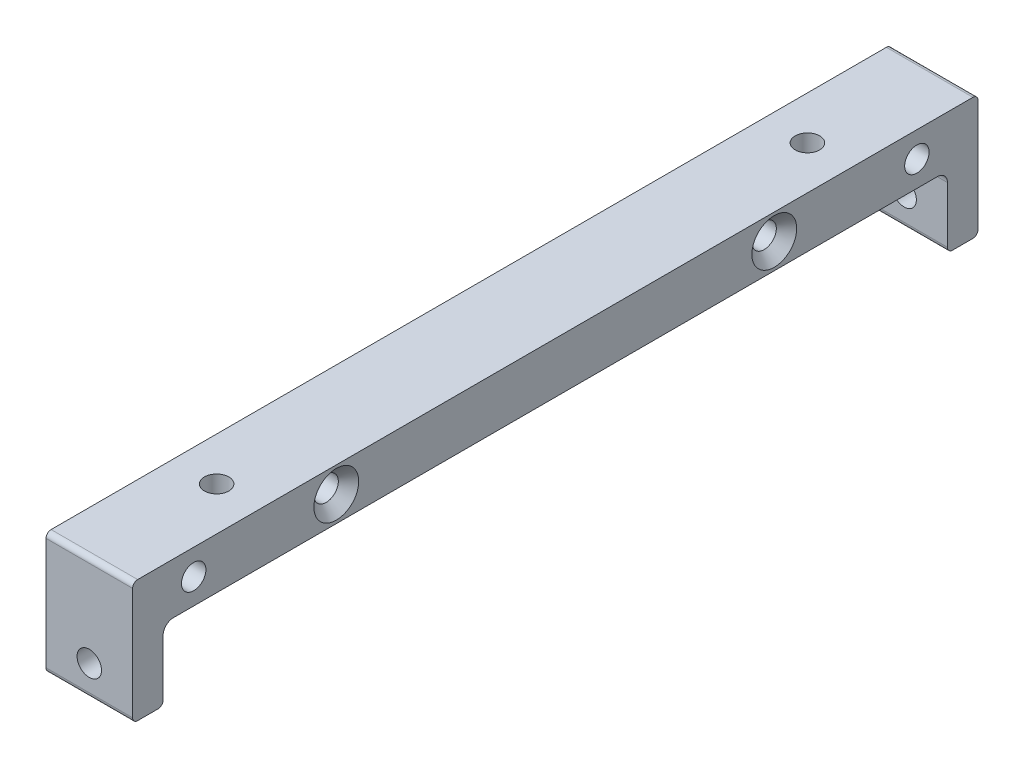
ISO-10303-21;
HEADER;
FILE_DESCRIPTION(('STEP AP214'),'2;1');
FILE_NAME('part.step','',(''),(''),'','','');
FILE_SCHEMA(('AUTOMOTIVE_DESIGN { 1 0 10303 214 1 1 1 1 }'));
ENDSEC;
DATA;
#1=APPLICATION_CONTEXT('core data for automotive mechanical design processes');
#2=APPLICATION_PROTOCOL_DEFINITION('international standard','automotive_design',2000,#1);
#3=PRODUCT_CONTEXT('',#1,'mechanical');
#4=PRODUCT('Part','Part','',(#3));
#5=PRODUCT_RELATED_PRODUCT_CATEGORY('part','',(#4));
#6=PRODUCT_DEFINITION_FORMATION('','',#4);
#7=PRODUCT_DEFINITION_CONTEXT('part definition',#1,'design');
#8=PRODUCT_DEFINITION('design','',#6,#7);
#9=PRODUCT_DEFINITION_SHAPE('','',#8);
#10=(LENGTH_UNIT() NAMED_UNIT(*) SI_UNIT(.MILLI.,.METRE.));
#11=(NAMED_UNIT(*) PLANE_ANGLE_UNIT() SI_UNIT($,.RADIAN.));
#12=(NAMED_UNIT(*) SI_UNIT($,.STERADIAN.) SOLID_ANGLE_UNIT());
#13=UNCERTAINTY_MEASURE_WITH_UNIT(LENGTH_MEASURE(1.E-05),#10,'distance_accuracy_value','');
#14=(GEOMETRIC_REPRESENTATION_CONTEXT(3) GLOBAL_UNCERTAINTY_ASSIGNED_CONTEXT((#13)) GLOBAL_UNIT_ASSIGNED_CONTEXT((#10,
#11,#12)) REPRESENTATION_CONTEXT('',''));
#15=CARTESIAN_POINT('',(0.,0.,0.));
#16=DIRECTION('',(0.,0.,1.));
#17=DIRECTION('',(1.,0.,0.));
#18=AXIS2_PLACEMENT_3D('',#15,#16,#17);
#19=CARTESIAN_POINT('',(-4.25,-6.,41.5));
#20=DIRECTION('',(0.,1.,0.));
#21=DIRECTION('',(0.,0.,1.));
#22=AXIS2_PLACEMENT_3D('',#19,#20,#21);
#23=PLANE('',#22);
#24=DIRECTION('',(0.,0.,-1.));
#25=VECTOR('',#24,1.);
#26=CARTESIAN_POINT('',(-4.25,-6.,41.5));
#27=LINE('',#26,#25);
#28=CARTESIAN_POINT('',(-4.25,-6.,41.));
#29=VERTEX_POINT('',#28);
#30=CARTESIAN_POINT('',(-4.25,-6.,39.));
#31=VERTEX_POINT('',#30);
#32=EDGE_CURVE('E274',#29,#31,#27,.T.);
#33=ORIENTED_EDGE('',*,*,#32,.T.);
#34=DIRECTION('',(1.,0.,0.));
#35=VECTOR('',#34,1.);
#36=CARTESIAN_POINT('',(-4.25,-6.,39.));
#37=LINE('',#36,#35);
#38=CARTESIAN_POINT('',(4.25,-6.,39.));
#39=VERTEX_POINT('',#38);
#40=EDGE_CURVE('E319',#31,#39,#37,.T.);
#41=ORIENTED_EDGE('',*,*,#40,.T.);
#42=DIRECTION('',(0.,0.,-1.));
#43=VECTOR('',#42,1.);
#44=CARTESIAN_POINT('',(4.25,-6.,41.5));
#45=LINE('',#44,#43);
#46=CARTESIAN_POINT('',(4.25,-6.,41.));
#47=VERTEX_POINT('',#46);
#48=EDGE_CURVE('E270',#47,#39,#45,.T.);
#49=ORIENTED_EDGE('',*,*,#48,.F.);
#50=DIRECTION('',(1.,0.,0.));
#51=VECTOR('',#50,1.);
#52=CARTESIAN_POINT('',(-4.25,-6.,41.));
#53=LINE('',#52,#51);
#54=EDGE_CURVE('E317',#47,#29,#53,.F.);
#55=ORIENTED_EDGE('',*,*,#54,.T.);
#56=EDGE_LOOP('',(#33,#41,#49,#55));
#57=FACE_BOUND('',#56,.T.);
#58=ADVANCED_FACE('F34',(#57),#23,.F.);
#59=CARTESIAN_POINT('',(4.25,-6.,41.5));
#60=DIRECTION('',(-1.,0.,0.));
#61=DIRECTION('',(0.,0.,1.));
#62=AXIS2_PLACEMENT_3D('',#59,#60,#61);
#63=PLANE('',#62);
#64=CARTESIAN_POINT('',(4.25,3.5,21.5));
#65=DIRECTION('',(1.,0.,0.));
#66=DIRECTION('',(0.,0.,-1.));
#67=AXIS2_PLACEMENT_3D('',#64,#65,#66);
#68=CIRCLE('',#67,2.2);
#69=CARTESIAN_POINT('',(4.25,3.5,19.3));
#70=VERTEX_POINT('',#69);
#71=EDGE_CURVE('E190',#70,#70,#68,.T.);
#72=ORIENTED_EDGE('',*,*,#71,.F.);
#73=EDGE_LOOP('',(#72));
#74=FACE_BOUND('',#73,.T.);
#75=CARTESIAN_POINT('',(4.25,3.5,-21.5));
#76=DIRECTION('',(1.,0.,0.));
#77=DIRECTION('',(0.,0.,-1.));
#78=AXIS2_PLACEMENT_3D('',#75,#76,#77);
#79=CIRCLE('',#78,2.2);
#80=CARTESIAN_POINT('',(4.25,3.5,-23.7));
#81=VERTEX_POINT('',#80);
#82=EDGE_CURVE('E199',#81,#81,#79,.T.);
#83=ORIENTED_EDGE('',*,*,#82,.F.);
#84=EDGE_LOOP('',(#83));
#85=FACE_BOUND('',#84,.T.);
#86=CARTESIAN_POINT('',(4.25,3.5,35.5));
#87=DIRECTION('',(1.,0.,0.));
#88=DIRECTION('',(0.,0.,-1.));
#89=AXIS2_PLACEMENT_3D('',#86,#87,#88);
#90=CIRCLE('',#89,1.2);
#91=CARTESIAN_POINT('',(4.25,3.5,34.3));
#92=VERTEX_POINT('',#91);
#93=EDGE_CURVE('E208',#92,#92,#90,.T.);
#94=ORIENTED_EDGE('',*,*,#93,.F.);
#95=EDGE_LOOP('',(#94));
#96=FACE_BOUND('',#95,.T.);
#97=CARTESIAN_POINT('',(4.25,3.5,-35.5));
#98=DIRECTION('',(1.,0.,0.));
#99=DIRECTION('',(0.,0.,-1.));
#100=AXIS2_PLACEMENT_3D('',#97,#98,#99);
#101=CIRCLE('',#100,1.2);
#102=CARTESIAN_POINT('',(4.25,3.5,-36.7));
#103=VERTEX_POINT('',#102);
#104=EDGE_CURVE('E214',#103,#103,#101,.T.);
#105=ORIENTED_EDGE('',*,*,#104,.F.);
#106=EDGE_LOOP('',(#105));
#107=FACE_BOUND('',#106,.T.);
#108=CARTESIAN_POINT('',(4.25,-6.,-39.));
#109=VERTEX_POINT('',#108);
#110=CARTESIAN_POINT('',(4.25,-6.,-41.));
#111=VERTEX_POINT('',#110);
#112=EDGE_CURVE('E265',#109,#111,#45,.T.);
#113=ORIENTED_EDGE('',*,*,#112,.T.);
#114=CARTESIAN_POINT('',(4.25,-5.5,-41.));
#115=DIRECTION('',(-1.,0.,0.));
#116=DIRECTION('',(0.,0.,1.));
#117=AXIS2_PLACEMENT_3D('',#114,#115,#116);
#118=CIRCLE('',#117,0.5);
#119=CARTESIAN_POINT('',(4.25,-5.5,-41.5));
#120=VERTEX_POINT('',#119);
#121=EDGE_CURVE('E298',#111,#120,#118,.F.);
#122=ORIENTED_EDGE('',*,*,#121,.T.);
#123=DIRECTION('',(0.,1.,0.));
#124=VECTOR('',#123,1.);
#125=CARTESIAN_POINT('',(4.25,-6.,-41.5));
#126=LINE('',#125,#124);
#127=CARTESIAN_POINT('',(4.25,5.5,-41.5));
#128=VERTEX_POINT('',#127);
#129=EDGE_CURVE('E251',#120,#128,#126,.T.);
#130=ORIENTED_EDGE('',*,*,#129,.T.);
#131=CARTESIAN_POINT('',(4.25,5.5,-41.));
#132=DIRECTION('',(-1.,0.,0.));
#133=DIRECTION('',(0.,0.,1.));
#134=AXIS2_PLACEMENT_3D('',#131,#132,#133);
#135=CIRCLE('',#134,0.5);
#136=CARTESIAN_POINT('',(4.25,6.,-41.));
#137=VERTEX_POINT('',#136);
#138=EDGE_CURVE('E290',#128,#137,#135,.F.);
#139=ORIENTED_EDGE('',*,*,#138,.T.);
#140=DIRECTION('',(0.,0.,-1.));
#141=VECTOR('',#140,1.);
#142=CARTESIAN_POINT('',(4.25,6.,41.5));
#143=LINE('',#142,#141);
#144=CARTESIAN_POINT('',(4.25,6.,41.));
#145=VERTEX_POINT('',#144);
#146=EDGE_CURVE('E280',#145,#137,#143,.T.);
#147=ORIENTED_EDGE('',*,*,#146,.F.);
#148=CARTESIAN_POINT('',(4.25,5.5,41.));
#149=DIRECTION('',(-1.,0.,0.));
#150=DIRECTION('',(0.,0.,1.));
#151=AXIS2_PLACEMENT_3D('',#148,#149,#150);
#152=CIRCLE('',#151,0.5);
#153=CARTESIAN_POINT('',(4.25,5.5,41.5));
#154=VERTEX_POINT('',#153);
#155=EDGE_CURVE('E288',#145,#154,#152,.F.);
#156=ORIENTED_EDGE('',*,*,#155,.T.);
#157=DIRECTION('',(0.,1.,0.));
#158=VECTOR('',#157,1.);
#159=CARTESIAN_POINT('',(4.25,-6.,41.5));
#160=LINE('',#159,#158);
#161=CARTESIAN_POINT('',(4.25,-5.5,41.5));
#162=VERTEX_POINT('',#161);
#163=EDGE_CURVE('E258',#162,#154,#160,.T.);
#164=ORIENTED_EDGE('',*,*,#163,.F.);
#165=CARTESIAN_POINT('',(4.25,-5.5,41.));
#166=DIRECTION('',(-1.,0.,0.));
#167=DIRECTION('',(0.,0.,1.));
#168=AXIS2_PLACEMENT_3D('',#165,#166,#167);
#169=CIRCLE('',#168,0.5);
#170=EDGE_CURVE('E292',#162,#47,#169,.F.);
#171=ORIENTED_EDGE('',*,*,#170,.T.);
#172=ORIENTED_EDGE('',*,*,#48,.T.);
#173=CARTESIAN_POINT('',(4.25,-5.5,39.));
#174=DIRECTION('',(-1.,0.,0.));
#175=DIRECTION('',(0.,0.,1.));
#176=AXIS2_PLACEMENT_3D('',#173,#174,#175);
#177=CIRCLE('',#176,0.5);
#178=CARTESIAN_POINT('',(4.25,-5.5,38.5));
#179=VERTEX_POINT('',#178);
#180=EDGE_CURVE('E294',#39,#179,#177,.F.);
#181=ORIENTED_EDGE('',*,*,#180,.T.);
#182=DIRECTION('',(0.,-1.,0.));
#183=VECTOR('',#182,1.);
#184=CARTESIAN_POINT('',(4.25,-6.00000000000001,38.5));
#185=LINE('',#184,#183);
#186=CARTESIAN_POINT('',(4.25,0.,38.5));
#187=VERTEX_POINT('',#186);
#188=EDGE_CURVE('E224',#187,#179,#185,.T.);
#189=ORIENTED_EDGE('',*,*,#188,.F.);
#190=CARTESIAN_POINT('',(4.25,0.,37.5));
#191=DIRECTION('',(1.,0.,0.));
#192=DIRECTION('',(0.,0.,-1.));
#193=AXIS2_PLACEMENT_3D('',#190,#191,#192);
#194=CIRCLE('',#193,1.);
#195=CARTESIAN_POINT('',(4.25,1.,37.5));
#196=VERTEX_POINT('',#195);
#197=EDGE_CURVE('E244',#196,#187,#194,.T.);
#198=ORIENTED_EDGE('',*,*,#197,.F.);
#199=DIRECTION('',(0.,0.,1.));
#200=VECTOR('',#199,1.);
#201=CARTESIAN_POINT('',(4.25,1.,37.5));
#202=LINE('',#201,#200);
#203=CARTESIAN_POINT('',(4.25,1.,-37.5));
#204=VERTEX_POINT('',#203);
#205=EDGE_CURVE('E241',#204,#196,#202,.T.);
#206=ORIENTED_EDGE('',*,*,#205,.F.);
#207=CARTESIAN_POINT('',(4.25,0.,-37.5));
#208=DIRECTION('',(1.,0.,0.));
#209=DIRECTION('',(0.,0.,1.));
#210=AXIS2_PLACEMENT_3D('',#207,#208,#209);
#211=CIRCLE('',#210,1.);
#212=CARTESIAN_POINT('',(4.25,0.,-38.5));
#213=VERTEX_POINT('',#212);
#214=EDGE_CURVE('E238',#213,#204,#211,.T.);
#215=ORIENTED_EDGE('',*,*,#214,.F.);
#216=DIRECTION('',(0.,1.,0.));
#217=VECTOR('',#216,1.);
#218=CARTESIAN_POINT('',(4.25,0.,-38.5));
#219=LINE('',#218,#217);
#220=CARTESIAN_POINT('',(4.25,-5.5,-38.5));
#221=VERTEX_POINT('',#220);
#222=EDGE_CURVE('E220',#221,#213,#219,.T.);
#223=ORIENTED_EDGE('',*,*,#222,.F.);
#224=CARTESIAN_POINT('',(4.25,-5.5,-39.));
#225=DIRECTION('',(-1.,0.,0.));
#226=DIRECTION('',(0.,0.,1.));
#227=AXIS2_PLACEMENT_3D('',#224,#225,#226);
#228=CIRCLE('',#227,0.5);
#229=EDGE_CURVE('E296',#221,#109,#228,.F.);
#230=ORIENTED_EDGE('',*,*,#229,.T.);
#231=EDGE_LOOP('',(#113,#122,#130,#139,#147,#156,#164,#171,#172,#181,#189,#198,#206,#215,#223,#230));
#232=FACE_BOUND('',#231,.T.);
#233=ADVANCED_FACE('F338',(#74,#85,#96,#107,#232),#63,.F.);
#234=CARTESIAN_POINT('',(-4.25,6.,41.5));
#235=DIRECTION('',(0.,-1.,0.));
#236=DIRECTION('',(0.,0.,-1.));
#237=AXIS2_PLACEMENT_3D('',#234,#235,#236);
#238=PLANE('',#237);
#239=CARTESIAN_POINT('',(0.,6.,-29.));
#240=DIRECTION('',(0.,1.,0.));
#241=DIRECTION('',(0.,0.,1.));
#242=AXIS2_PLACEMENT_3D('',#239,#240,#241);
#243=CIRCLE('',#242,1.19999999999999);
#244=CARTESIAN_POINT('',(0.,6.,-27.8));
#245=VERTEX_POINT('',#244);
#246=EDGE_CURVE('E165',#245,#245,#243,.T.);
#247=ORIENTED_EDGE('',*,*,#246,.F.);
#248=EDGE_LOOP('',(#247));
#249=FACE_BOUND('',#248,.T.);
#250=CARTESIAN_POINT('',(0.,6.,29.));
#251=DIRECTION('',(0.,1.,0.));
#252=DIRECTION('',(0.,0.,1.));
#253=AXIS2_PLACEMENT_3D('',#250,#251,#252);
#254=CIRCLE('',#253,1.19999999999999);
#255=CARTESIAN_POINT('',(0.,6.,30.2));
#256=VERTEX_POINT('',#255);
#257=EDGE_CURVE('E178',#256,#256,#254,.T.);
#258=ORIENTED_EDGE('',*,*,#257,.F.);
#259=EDGE_LOOP('',(#258));
#260=FACE_BOUND('',#259,.T.);
#261=ORIENTED_EDGE('',*,*,#146,.T.);
#262=DIRECTION('',(-1.,0.,0.));
#263=VECTOR('',#262,1.);
#264=CARTESIAN_POINT('',(-4.25,6.,-41.));
#265=LINE('',#264,#263);
#266=CARTESIAN_POINT('',(-4.25,6.,-41.));
#267=VERTEX_POINT('',#266);
#268=EDGE_CURVE('E11',#137,#267,#265,.T.);
#269=ORIENTED_EDGE('',*,*,#268,.T.);
#270=DIRECTION('',(0.,0.,-1.));
#271=VECTOR('',#270,1.);
#272=CARTESIAN_POINT('',(-4.25,6.,41.5));
#273=LINE('',#272,#271);
#274=CARTESIAN_POINT('',(-4.25,6.,41.));
#275=VERTEX_POINT('',#274);
#276=EDGE_CURVE('E277',#275,#267,#273,.T.);
#277=ORIENTED_EDGE('',*,*,#276,.F.);
#278=DIRECTION('',(-1.,0.,0.));
#279=VECTOR('',#278,1.);
#280=CARTESIAN_POINT('',(-4.25,6.,41.));
#281=LINE('',#280,#279);
#282=EDGE_CURVE('E42',#275,#145,#281,.F.);
#283=ORIENTED_EDGE('',*,*,#282,.T.);
#284=EDGE_LOOP('',(#261,#269,#277,#283));
#285=FACE_BOUND('',#284,.T.);
#286=ADVANCED_FACE('F333',(#249,#260,#285),#238,.F.);
#287=CARTESIAN_POINT('',(-4.25,-6.,41.5));
#288=DIRECTION('',(1.,0.,0.));
#289=DIRECTION('',(0.,0.,-1.));
#290=AXIS2_PLACEMENT_3D('',#287,#288,#289);
#291=PLANE('',#290);
#292=CARTESIAN_POINT('',(-4.25,3.5,0.));
#293=DIRECTION('',(-1.,0.,0.));
#294=DIRECTION('',(0.,0.,1.));
#295=AXIS2_PLACEMENT_3D('',#292,#293,#294);
#296=CIRCLE('',#295,1.2);
#297=CARTESIAN_POINT('',(-4.25,3.5,1.2));
#298=VERTEX_POINT('',#297);
#299=EDGE_CURVE('E166',#298,#298,#296,.T.);
#300=ORIENTED_EDGE('',*,*,#299,.F.);
#301=EDGE_LOOP('',(#300));
#302=FACE_BOUND('',#301,.T.);
#303=CARTESIAN_POINT('',(-4.25,3.5,21.5));
#304=DIRECTION('',(1.,0.,0.));
#305=DIRECTION('',(0.,0.,-1.));
#306=AXIS2_PLACEMENT_3D('',#303,#304,#305);
#307=CIRCLE('',#306,1.2);
#308=CARTESIAN_POINT('',(-4.25,3.5,20.3));
#309=VERTEX_POINT('',#308);
#310=EDGE_CURVE('E196',#309,#309,#307,.T.);
#311=ORIENTED_EDGE('',*,*,#310,.T.);
#312=EDGE_LOOP('',(#311));
#313=FACE_BOUND('',#312,.T.);
#314=CARTESIAN_POINT('',(-4.25,3.5,-21.5));
#315=DIRECTION('',(1.,0.,0.));
#316=DIRECTION('',(0.,0.,-1.));
#317=AXIS2_PLACEMENT_3D('',#314,#315,#316);
#318=CIRCLE('',#317,1.2);
#319=CARTESIAN_POINT('',(-4.25,3.5,-22.7));
#320=VERTEX_POINT('',#319);
#321=EDGE_CURVE('E205',#320,#320,#318,.T.);
#322=ORIENTED_EDGE('',*,*,#321,.T.);
#323=EDGE_LOOP('',(#322));
#324=FACE_BOUND('',#323,.T.);
#325=DIRECTION('',(0.,-1.,0.));
#326=VECTOR('',#325,1.);
#327=CARTESIAN_POINT('',(-4.25,-6.,-41.5));
#328=LINE('',#327,#326);
#329=CARTESIAN_POINT('',(-4.25,5.5,-41.5));
#330=VERTEX_POINT('',#329);
#331=CARTESIAN_POINT('',(-4.25,-5.5,-41.5));
#332=VERTEX_POINT('',#331);
#333=EDGE_CURVE('E262',#330,#332,#328,.T.);
#334=ORIENTED_EDGE('',*,*,#333,.T.);
#335=CARTESIAN_POINT('',(-4.25,-5.5,-41.));
#336=DIRECTION('',(1.,0.,0.));
#337=DIRECTION('',(0.,0.,-1.));
#338=AXIS2_PLACEMENT_3D('',#335,#336,#337);
#339=CIRCLE('',#338,0.5);
#340=CARTESIAN_POINT('',(-4.25,-6.,-41.));
#341=VERTEX_POINT('',#340);
#342=EDGE_CURVE('E312',#332,#341,#339,.F.);
#343=ORIENTED_EDGE('',*,*,#342,.T.);
#344=CARTESIAN_POINT('',(-4.25,-6.,-39.));
#345=VERTEX_POINT('',#344);
#346=EDGE_CURVE('E273',#345,#341,#27,.T.);
#347=ORIENTED_EDGE('',*,*,#346,.F.);
#348=CARTESIAN_POINT('',(-4.25,-5.5,-39.));
#349=DIRECTION('',(1.,0.,0.));
#350=DIRECTION('',(0.,0.,-1.));
#351=AXIS2_PLACEMENT_3D('',#348,#349,#350);
#352=CIRCLE('',#351,0.5);
#353=CARTESIAN_POINT('',(-4.25,-5.5,-38.5));
#354=VERTEX_POINT('',#353);
#355=EDGE_CURVE('E49',#345,#354,#352,.F.);
#356=ORIENTED_EDGE('',*,*,#355,.T.);
#357=DIRECTION('',(0.,1.,0.));
#358=VECTOR('',#357,1.);
#359=CARTESIAN_POINT('',(-4.25,0.,-38.5));
#360=LINE('',#359,#358);
#361=CARTESIAN_POINT('',(-4.25,0.,-38.5));
#362=VERTEX_POINT('',#361);
#363=EDGE_CURVE('E221',#354,#362,#360,.T.);
#364=ORIENTED_EDGE('',*,*,#363,.T.);
#365=CARTESIAN_POINT('',(-4.25,0.,-37.5));
#366=DIRECTION('',(1.,0.,0.));
#367=DIRECTION('',(0.,0.,1.));
#368=AXIS2_PLACEMENT_3D('',#365,#366,#367);
#369=CIRCLE('',#368,1.);
#370=CARTESIAN_POINT('',(-4.25,1.,-37.5));
#371=VERTEX_POINT('',#370);
#372=EDGE_CURVE('E223',#362,#371,#369,.T.);
#373=ORIENTED_EDGE('',*,*,#372,.T.);
#374=DIRECTION('',(0.,0.,1.));
#375=VECTOR('',#374,1.);
#376=CARTESIAN_POINT('',(-4.25,1.,37.5));
#377=LINE('',#376,#375);
#378=CARTESIAN_POINT('',(-4.25,1.,37.5));
#379=VERTEX_POINT('',#378);
#380=EDGE_CURVE('E227',#371,#379,#377,.T.);
#381=ORIENTED_EDGE('',*,*,#380,.T.);
#382=CARTESIAN_POINT('',(-4.25,0.,37.5));
#383=DIRECTION('',(1.,0.,0.));
#384=DIRECTION('',(0.,0.,-1.));
#385=AXIS2_PLACEMENT_3D('',#382,#383,#384);
#386=CIRCLE('',#385,1.);
#387=CARTESIAN_POINT('',(-4.25,0.,38.5));
#388=VERTEX_POINT('',#387);
#389=EDGE_CURVE('E230',#379,#388,#386,.T.);
#390=ORIENTED_EDGE('',*,*,#389,.T.);
#391=DIRECTION('',(0.,-1.,0.));
#392=VECTOR('',#391,1.);
#393=CARTESIAN_POINT('',(-4.25,-6.00000000000001,38.5));
#394=LINE('',#393,#392);
#395=CARTESIAN_POINT('',(-4.25,-5.5,38.5));
#396=VERTEX_POINT('',#395);
#397=EDGE_CURVE('E233',#388,#396,#394,.T.);
#398=ORIENTED_EDGE('',*,*,#397,.T.);
#399=CARTESIAN_POINT('',(-4.25,-5.5,39.));
#400=DIRECTION('',(1.,0.,0.));
#401=DIRECTION('',(0.,0.,-1.));
#402=AXIS2_PLACEMENT_3D('',#399,#400,#401);
#403=CIRCLE('',#402,0.5);
#404=EDGE_CURVE('E309',#396,#31,#403,.F.);
#405=ORIENTED_EDGE('',*,*,#404,.T.);
#406=ORIENTED_EDGE('',*,*,#32,.F.);
#407=CARTESIAN_POINT('',(-4.25,-5.5,41.));
#408=DIRECTION('',(1.,0.,0.));
#409=DIRECTION('',(0.,0.,-1.));
#410=AXIS2_PLACEMENT_3D('',#407,#408,#409);
#411=CIRCLE('',#410,0.5);
#412=CARTESIAN_POINT('',(-4.25,-5.5,41.5));
#413=VERTEX_POINT('',#412);
#414=EDGE_CURVE('E307',#29,#413,#411,.F.);
#415=ORIENTED_EDGE('',*,*,#414,.T.);
#416=DIRECTION('',(0.,-1.,0.));
#417=VECTOR('',#416,1.);
#418=CARTESIAN_POINT('',(-4.25,-6.,41.5));
#419=LINE('',#418,#417);
#420=CARTESIAN_POINT('',(-4.25,5.5,41.5));
#421=VERTEX_POINT('',#420);
#422=EDGE_CURVE('E261',#421,#413,#419,.T.);
#423=ORIENTED_EDGE('',*,*,#422,.F.);
#424=CARTESIAN_POINT('',(-4.25,5.5,41.));
#425=DIRECTION('',(1.,0.,0.));
#426=DIRECTION('',(0.,0.,-1.));
#427=AXIS2_PLACEMENT_3D('',#424,#425,#426);
#428=CIRCLE('',#427,0.5);
#429=EDGE_CURVE('E304',#421,#275,#428,.F.);
#430=ORIENTED_EDGE('',*,*,#429,.T.);
#431=ORIENTED_EDGE('',*,*,#276,.T.);
#432=CARTESIAN_POINT('',(-4.25,5.5,-41.));
#433=DIRECTION('',(1.,0.,0.));
#434=DIRECTION('',(0.,0.,-1.));
#435=AXIS2_PLACEMENT_3D('',#432,#433,#434);
#436=CIRCLE('',#435,0.5);
#437=EDGE_CURVE('E57',#267,#330,#436,.F.);
#438=ORIENTED_EDGE('',*,*,#437,.T.);
#439=EDGE_LOOP('',(#334,#343,#347,#356,#364,#373,#381,#390,#398,#405,#406,#415,#423,#430,#431,#438));
#440=FACE_BOUND('',#439,.T.);
#441=ADVANCED_FACE('F346',(#302,#313,#324,#440),#291,.F.);
#442=ORIENTED_EDGE('',*,*,#346,.T.);
#443=DIRECTION('',(1.,0.,0.));
#444=VECTOR('',#443,1.);
#445=CARTESIAN_POINT('',(4.25,-6.,-41.));
#446=LINE('',#445,#444);
#447=EDGE_CURVE('E285',#341,#111,#446,.T.);
#448=ORIENTED_EDGE('',*,*,#447,.T.);
#449=ORIENTED_EDGE('',*,*,#112,.F.);
#450=DIRECTION('',(1.,0.,0.));
#451=VECTOR('',#450,1.);
#452=CARTESIAN_POINT('',(-4.25,-6.,-39.));
#453=LINE('',#452,#451);
#454=EDGE_CURVE('E283',#109,#345,#453,.F.);
#455=ORIENTED_EDGE('',*,*,#454,.T.);
#456=EDGE_LOOP('',(#442,#448,#449,#455));
#457=FACE_BOUND('',#456,.T.);
#458=ADVANCED_FACE('F385',(#457),#23,.F.);
#459=CARTESIAN_POINT('',(0.,0.,41.5));
#460=DIRECTION('',(0.,0.,-1.));
#461=DIRECTION('',(-1.,0.,0.));
#462=AXIS2_PLACEMENT_3D('',#459,#460,#461);
#463=PLANE('',#462);
#464=CARTESIAN_POINT('',(0.,-3.,41.5));
#465=DIRECTION('',(0.,0.,1.));
#466=DIRECTION('',(1.,0.,0.));
#467=AXIS2_PLACEMENT_3D('',#464,#465,#466);
#468=CIRCLE('',#467,1.19999999999998);
#469=CARTESIAN_POINT('',(1.19999999999998,-3.,41.5));
#470=VERTEX_POINT('',#469);
#471=EDGE_CURVE('E184',#470,#470,#468,.T.);
#472=ORIENTED_EDGE('',*,*,#471,.F.);
#473=EDGE_LOOP('',(#472));
#474=FACE_BOUND('',#473,.T.);
#475=ORIENTED_EDGE('',*,*,#422,.T.);
#476=DIRECTION('',(1.,0.,0.));
#477=VECTOR('',#476,1.);
#478=CARTESIAN_POINT('',(0.,-5.5,41.5));
#479=LINE('',#478,#477);
#480=EDGE_CURVE('E327',#413,#162,#479,.T.);
#481=ORIENTED_EDGE('',*,*,#480,.T.);
#482=ORIENTED_EDGE('',*,*,#163,.T.);
#483=DIRECTION('',(-1.,0.,0.));
#484=VECTOR('',#483,1.);
#485=CARTESIAN_POINT('',(0.,5.5,41.5));
#486=LINE('',#485,#484);
#487=EDGE_CURVE('E324',#154,#421,#486,.T.);
#488=ORIENTED_EDGE('',*,*,#487,.T.);
#489=EDGE_LOOP('',(#475,#481,#482,#488));
#490=FACE_BOUND('',#489,.T.);
#491=ADVANCED_FACE('F344',(#474,#490),#463,.F.);
#492=CARTESIAN_POINT('',(0.,0.,-41.5));
#493=DIRECTION('',(0.,0.,-1.));
#494=DIRECTION('',(-1.,0.,0.));
#495=AXIS2_PLACEMENT_3D('',#492,#493,#494);
#496=PLANE('',#495);
#497=CARTESIAN_POINT('',(0.,-3.,-41.5));
#498=DIRECTION('',(0.,0.,-1.));
#499=DIRECTION('',(-1.,0.,0.));
#500=AXIS2_PLACEMENT_3D('',#497,#498,#499);
#501=CIRCLE('',#500,1.19999999999999);
#502=CARTESIAN_POINT('',(-1.19999999999999,-3.,-41.5));
#503=VERTEX_POINT('',#502);
#504=EDGE_CURVE('E482',#503,#503,#501,.T.);
#505=ORIENTED_EDGE('',*,*,#504,.F.);
#506=EDGE_LOOP('',(#505));
#507=FACE_BOUND('',#506,.T.);
#508=ORIENTED_EDGE('',*,*,#129,.F.);
#509=DIRECTION('',(1.,0.,0.));
#510=VECTOR('',#509,1.);
#511=CARTESIAN_POINT('',(-4.25,-5.5,-41.5));
#512=LINE('',#511,#510);
#513=EDGE_CURVE('E302',#120,#332,#512,.F.);
#514=ORIENTED_EDGE('',*,*,#513,.T.);
#515=ORIENTED_EDGE('',*,*,#333,.F.);
#516=DIRECTION('',(-1.,0.,0.));
#517=VECTOR('',#516,1.);
#518=CARTESIAN_POINT('',(4.25,5.5,-41.5));
#519=LINE('',#518,#517);
#520=EDGE_CURVE('E300',#330,#128,#519,.F.);
#521=ORIENTED_EDGE('',*,*,#520,.T.);
#522=EDGE_LOOP('',(#508,#514,#515,#521));
#523=FACE_BOUND('',#522,.T.);
#524=ADVANCED_FACE('F412',(#507,#523),#496,.T.);
#525=CARTESIAN_POINT('',(-4.25,-6.00000000000001,38.5));
#526=DIRECTION('',(0.,0.,1.));
#527=DIRECTION('',(1.,0.,0.));
#528=AXIS2_PLACEMENT_3D('',#525,#526,#527);
#529=PLANE('',#528);
#530=CARTESIAN_POINT('',(0.,-3.,38.5));
#531=DIRECTION('',(0.,0.,1.));
#532=DIRECTION('',(1.,0.,0.));
#533=AXIS2_PLACEMENT_3D('',#530,#531,#532);
#534=CIRCLE('',#533,1.19999999999997);
#535=CARTESIAN_POINT('',(1.19999999999997,-3.,38.5));
#536=VERTEX_POINT('',#535);
#537=EDGE_CURVE('E187',#536,#536,#534,.T.);
#538=ORIENTED_EDGE('',*,*,#537,.T.);
#539=EDGE_LOOP('',(#538));
#540=FACE_BOUND('',#539,.T.);
#541=ORIENTED_EDGE('',*,*,#188,.T.);
#542=DIRECTION('',(1.,0.,0.));
#543=VECTOR('',#542,1.);
#544=CARTESIAN_POINT('',(-4.25,-5.5,38.5));
#545=LINE('',#544,#543);
#546=EDGE_CURVE('E322',#179,#396,#545,.F.);
#547=ORIENTED_EDGE('',*,*,#546,.T.);
#548=ORIENTED_EDGE('',*,*,#397,.F.);
#549=DIRECTION('',(1.,0.,0.));
#550=VECTOR('',#549,1.);
#551=CARTESIAN_POINT('',(-4.25,0.,38.5));
#552=LINE('',#551,#550);
#553=EDGE_CURVE('E249',#388,#187,#552,.T.);
#554=ORIENTED_EDGE('',*,*,#553,.T.);
#555=EDGE_LOOP('',(#541,#547,#548,#554));
#556=FACE_BOUND('',#555,.T.);
#557=ADVANCED_FACE('F362',(#540,#556),#529,.F.);
#558=CARTESIAN_POINT('',(-4.25,0.,37.5));
#559=DIRECTION('',(1.,0.,0.));
#560=DIRECTION('',(0.,0.,-1.));
#561=AXIS2_PLACEMENT_3D('',#558,#559,#560);
#562=CYLINDRICAL_SURFACE('',#561,1.);
#563=ORIENTED_EDGE('',*,*,#197,.T.);
#564=ORIENTED_EDGE('',*,*,#553,.F.);
#565=ORIENTED_EDGE('',*,*,#389,.F.);
#566=DIRECTION('',(1.,0.,0.));
#567=VECTOR('',#566,1.);
#568=CARTESIAN_POINT('',(-4.25,1.,37.5));
#569=LINE('',#568,#567);
#570=EDGE_CURVE('E252',#379,#196,#569,.T.);
#571=ORIENTED_EDGE('',*,*,#570,.T.);
#572=EDGE_LOOP('',(#563,#564,#565,#571));
#573=FACE_BOUND('',#572,.T.);
#574=ADVANCED_FACE('F366',(#573),#562,.F.);
#575=CARTESIAN_POINT('',(-4.25,1.,37.5));
#576=DIRECTION('',(0.,1.,0.));
#577=DIRECTION('',(0.,0.,1.));
#578=AXIS2_PLACEMENT_3D('',#575,#576,#577);
#579=PLANE('',#578);
#580=CARTESIAN_POINT('',(0.,1.,-29.));
#581=DIRECTION('',(0.,1.,0.));
#582=DIRECTION('',(0.,0.,1.));
#583=AXIS2_PLACEMENT_3D('',#580,#581,#582);
#584=CIRCLE('',#583,1.19999999999999);
#585=CARTESIAN_POINT('',(0.,1.,-27.8));
#586=VERTEX_POINT('',#585);
#587=EDGE_CURVE('E169',#586,#586,#584,.T.);
#588=ORIENTED_EDGE('',*,*,#587,.T.);
#589=EDGE_LOOP('',(#588));
#590=FACE_BOUND('',#589,.T.);
#591=CARTESIAN_POINT('',(0.,1.,29.));
#592=DIRECTION('',(0.,1.,0.));
#593=DIRECTION('',(0.,0.,1.));
#594=AXIS2_PLACEMENT_3D('',#591,#592,#593);
#595=CIRCLE('',#594,1.19999999999999);
#596=CARTESIAN_POINT('',(0.,1.,30.2));
#597=VERTEX_POINT('',#596);
#598=EDGE_CURVE('E181',#597,#597,#595,.T.);
#599=ORIENTED_EDGE('',*,*,#598,.T.);
#600=EDGE_LOOP('',(#599));
#601=FACE_BOUND('',#600,.T.);
#602=ORIENTED_EDGE('',*,*,#205,.T.);
#603=ORIENTED_EDGE('',*,*,#570,.F.);
#604=ORIENTED_EDGE('',*,*,#380,.F.);
#605=DIRECTION('',(1.,0.,0.));
#606=VECTOR('',#605,1.);
#607=CARTESIAN_POINT('',(-4.25,1.,-37.5));
#608=LINE('',#607,#606);
#609=EDGE_CURVE('E254',#371,#204,#608,.T.);
#610=ORIENTED_EDGE('',*,*,#609,.T.);
#611=EDGE_LOOP('',(#602,#603,#604,#610));
#612=FACE_BOUND('',#611,.T.);
#613=ADVANCED_FACE('F371',(#590,#601,#612),#579,.F.);
#614=CARTESIAN_POINT('',(-4.25,0.,-37.5));
#615=DIRECTION('',(1.,0.,0.));
#616=DIRECTION('',(0.,0.,-1.));
#617=AXIS2_PLACEMENT_3D('',#614,#615,#616);
#618=CYLINDRICAL_SURFACE('',#617,1.);
#619=ORIENTED_EDGE('',*,*,#214,.T.);
#620=ORIENTED_EDGE('',*,*,#609,.F.);
#621=ORIENTED_EDGE('',*,*,#372,.F.);
#622=DIRECTION('',(1.,0.,0.));
#623=VECTOR('',#622,1.);
#624=CARTESIAN_POINT('',(-4.25,0.,-38.5));
#625=LINE('',#624,#623);
#626=EDGE_CURVE('E236',#362,#213,#625,.T.);
#627=ORIENTED_EDGE('',*,*,#626,.T.);
#628=EDGE_LOOP('',(#619,#620,#621,#627));
#629=FACE_BOUND('',#628,.T.);
#630=ADVANCED_FACE('F375',(#629),#618,.F.);
#631=CARTESIAN_POINT('',(-4.25,0.,-38.5));
#632=DIRECTION('',(0.,0.,-1.));
#633=DIRECTION('',(0.,1.,0.));
#634=AXIS2_PLACEMENT_3D('',#631,#632,#633);
#635=PLANE('',#634);
#636=CARTESIAN_POINT('',(0.,-3.,-38.5));
#637=DIRECTION('',(0.,0.,-1.));
#638=DIRECTION('',(0.,1.,0.));
#639=AXIS2_PLACEMENT_3D('',#636,#637,#638);
#640=CIRCLE('',#639,1.19999999999999);
#641=CARTESIAN_POINT('',(0.,-1.80000000000001,-38.5));
#642=VERTEX_POINT('',#641);
#643=EDGE_CURVE('E172',#642,#642,#640,.T.);
#644=ORIENTED_EDGE('',*,*,#643,.T.);
#645=EDGE_LOOP('',(#644));
#646=FACE_BOUND('',#645,.T.);
#647=ORIENTED_EDGE('',*,*,#363,.F.);
#648=DIRECTION('',(1.,0.,0.));
#649=VECTOR('',#648,1.);
#650=CARTESIAN_POINT('',(-4.25,-5.5,-38.5));
#651=LINE('',#650,#649);
#652=EDGE_CURVE('E314',#354,#221,#651,.T.);
#653=ORIENTED_EDGE('',*,*,#652,.T.);
#654=ORIENTED_EDGE('',*,*,#222,.T.);
#655=ORIENTED_EDGE('',*,*,#626,.F.);
#656=EDGE_LOOP('',(#647,#653,#654,#655));
#657=FACE_BOUND('',#656,.T.);
#658=ADVANCED_FACE('F378',(#646,#657),#635,.F.);
#659=CARTESIAN_POINT('',(-4.25,-5.5,-41.));
#660=DIRECTION('',(-1.,0.,0.));
#661=DIRECTION('',(0.,0.,1.));
#662=AXIS2_PLACEMENT_3D('',#659,#660,#661);
#663=CYLINDRICAL_SURFACE('',#662,0.5);
#664=ORIENTED_EDGE('',*,*,#342,.F.);
#665=ORIENTED_EDGE('',*,*,#513,.F.);
#666=ORIENTED_EDGE('',*,*,#121,.F.);
#667=ORIENTED_EDGE('',*,*,#447,.F.);
#668=EDGE_LOOP('',(#664,#665,#666,#667));
#669=FACE_BOUND('',#668,.T.);
#670=ADVANCED_FACE('F389',(#669),#663,.T.);
#671=CARTESIAN_POINT('',(-4.25,-5.5,-39.));
#672=DIRECTION('',(1.,0.,0.));
#673=DIRECTION('',(0.,0.,-1.));
#674=AXIS2_PLACEMENT_3D('',#671,#672,#673);
#675=CYLINDRICAL_SURFACE('',#674,0.5);
#676=ORIENTED_EDGE('',*,*,#355,.F.);
#677=ORIENTED_EDGE('',*,*,#454,.F.);
#678=ORIENTED_EDGE('',*,*,#229,.F.);
#679=ORIENTED_EDGE('',*,*,#652,.F.);
#680=EDGE_LOOP('',(#676,#677,#678,#679));
#681=FACE_BOUND('',#680,.T.);
#682=ADVANCED_FACE('F387',(#681),#675,.T.);
#683=CARTESIAN_POINT('',(-4.25,-5.5,39.));
#684=DIRECTION('',(1.,0.,0.));
#685=DIRECTION('',(0.,0.,-1.));
#686=AXIS2_PLACEMENT_3D('',#683,#684,#685);
#687=CYLINDRICAL_SURFACE('',#686,0.5);
#688=ORIENTED_EDGE('',*,*,#404,.F.);
#689=ORIENTED_EDGE('',*,*,#546,.F.);
#690=ORIENTED_EDGE('',*,*,#180,.F.);
#691=ORIENTED_EDGE('',*,*,#40,.F.);
#692=EDGE_LOOP('',(#688,#689,#690,#691));
#693=FACE_BOUND('',#692,.T.);
#694=ADVANCED_FACE('F357',(#693),#687,.T.);
#695=CARTESIAN_POINT('',(0.,-5.5,41.));
#696=DIRECTION('',(1.,0.,0.));
#697=DIRECTION('',(0.,0.,-1.));
#698=AXIS2_PLACEMENT_3D('',#695,#696,#697);
#699=CYLINDRICAL_SURFACE('',#698,0.5);
#700=ORIENTED_EDGE('',*,*,#414,.F.);
#701=ORIENTED_EDGE('',*,*,#54,.F.);
#702=ORIENTED_EDGE('',*,*,#170,.F.);
#703=ORIENTED_EDGE('',*,*,#480,.F.);
#704=EDGE_LOOP('',(#700,#701,#702,#703));
#705=FACE_BOUND('',#704,.T.);
#706=ADVANCED_FACE('F351',(#705),#699,.T.);
#707=CARTESIAN_POINT('',(-4.25,5.5,-41.));
#708=DIRECTION('',(1.,0.,0.));
#709=DIRECTION('',(0.,0.,-1.));
#710=AXIS2_PLACEMENT_3D('',#707,#708,#709);
#711=CYLINDRICAL_SURFACE('',#710,0.5);
#712=ORIENTED_EDGE('',*,*,#138,.F.);
#713=ORIENTED_EDGE('',*,*,#520,.F.);
#714=ORIENTED_EDGE('',*,*,#437,.F.);
#715=ORIENTED_EDGE('',*,*,#268,.F.);
#716=EDGE_LOOP('',(#712,#713,#714,#715));
#717=FACE_BOUND('',#716,.T.);
#718=ADVANCED_FACE('F487',(#717),#711,.T.);
#719=CARTESIAN_POINT('',(0.,5.5,41.));
#720=DIRECTION('',(-1.,0.,0.));
#721=DIRECTION('',(0.,0.,1.));
#722=AXIS2_PLACEMENT_3D('',#719,#720,#721);
#723=CYLINDRICAL_SURFACE('',#722,0.5);
#724=ORIENTED_EDGE('',*,*,#155,.F.);
#725=ORIENTED_EDGE('',*,*,#282,.F.);
#726=ORIENTED_EDGE('',*,*,#429,.F.);
#727=ORIENTED_EDGE('',*,*,#487,.F.);
#728=EDGE_LOOP('',(#724,#725,#726,#727));
#729=FACE_BOUND('',#728,.T.);
#730=ADVANCED_FACE('F36',(#729),#723,.T.);
#731=CARTESIAN_POINT('',(-0.750000000000002,3.5,-35.5));
#732=DIRECTION('',(1.,0.,0.));
#733=DIRECTION('',(0.,0.,-1.));
#734=AXIS2_PLACEMENT_3D('',#731,#732,#733);
#735=CONICAL_SURFACE('',#734,1.2,1.02974425867665);
#736=CARTESIAN_POINT('',(-1.47103274283307,3.5,-35.5));
#737=VERTEX_POINT('',#736);
#738=VERTEX_LOOP('',#737);
#739=FACE_BOUND('',#738,.T.);
#740=CARTESIAN_POINT('',(-0.750000000000002,3.5,-35.5));
#741=DIRECTION('',(1.,0.,0.));
#742=DIRECTION('',(0.,0.,-1.));
#743=AXIS2_PLACEMENT_3D('',#740,#741,#742);
#744=CIRCLE('',#743,1.2);
#745=CARTESIAN_POINT('',(-0.750000000000002,3.5,-36.7));
#746=VERTEX_POINT('',#745);
#747=EDGE_CURVE('E217',#746,#746,#744,.T.);
#748=ORIENTED_EDGE('',*,*,#747,.T.);
#749=EDGE_LOOP('',(#748));
#750=FACE_BOUND('',#749,.T.);
#751=ADVANCED_FACE('F449',(#739,#750),#735,.F.);
#752=CARTESIAN_POINT('',(4.25,3.5,-35.5));
#753=DIRECTION('',(1.,0.,0.));
#754=DIRECTION('',(0.,0.,-1.));
#755=AXIS2_PLACEMENT_3D('',#752,#753,#754);
#756=CYLINDRICAL_SURFACE('',#755,1.2);
#757=ORIENTED_EDGE('',*,*,#747,.F.);
#758=EDGE_LOOP('',(#757));
#759=FACE_BOUND('',#758,.T.);
#760=ORIENTED_EDGE('',*,*,#104,.T.);
#761=EDGE_LOOP('',(#760));
#762=FACE_BOUND('',#761,.T.);
#763=ADVANCED_FACE('F446',(#759,#762),#756,.F.);
#764=CARTESIAN_POINT('',(-0.750000000000002,3.5,35.5));
#765=DIRECTION('',(1.,0.,0.));
#766=DIRECTION('',(0.,0.,-1.));
#767=AXIS2_PLACEMENT_3D('',#764,#765,#766);
#768=CONICAL_SURFACE('',#767,1.2,1.02974425867665);
#769=CARTESIAN_POINT('',(-1.47103274283307,3.5,35.5));
#770=VERTEX_POINT('',#769);
#771=VERTEX_LOOP('',#770);
#772=FACE_BOUND('',#771,.T.);
#773=CARTESIAN_POINT('',(-0.750000000000002,3.5,35.5));
#774=DIRECTION('',(1.,0.,0.));
#775=DIRECTION('',(0.,0.,-1.));
#776=AXIS2_PLACEMENT_3D('',#773,#774,#775);
#777=CIRCLE('',#776,1.2);
#778=CARTESIAN_POINT('',(-0.750000000000002,3.5,34.3));
#779=VERTEX_POINT('',#778);
#780=EDGE_CURVE('E211',#779,#779,#777,.T.);
#781=ORIENTED_EDGE('',*,*,#780,.T.);
#782=EDGE_LOOP('',(#781));
#783=FACE_BOUND('',#782,.T.);
#784=ADVANCED_FACE('F448',(#772,#783),#768,.F.);
#785=CARTESIAN_POINT('',(4.25,3.5,35.5));
#786=DIRECTION('',(1.,0.,0.));
#787=DIRECTION('',(0.,0.,-1.));
#788=AXIS2_PLACEMENT_3D('',#785,#786,#787);
#789=CYLINDRICAL_SURFACE('',#788,1.2);
#790=ORIENTED_EDGE('',*,*,#780,.F.);
#791=EDGE_LOOP('',(#790));
#792=FACE_BOUND('',#791,.T.);
#793=ORIENTED_EDGE('',*,*,#93,.T.);
#794=EDGE_LOOP('',(#793));
#795=FACE_BOUND('',#794,.T.);
#796=ADVANCED_FACE('F431',(#792,#795),#789,.F.);
#797=CARTESIAN_POINT('',(4.25,3.5,-21.5));
#798=DIRECTION('',(1.,0.,0.));
#799=DIRECTION('',(0.,0.,-1.));
#800=AXIS2_PLACEMENT_3D('',#797,#798,#799);
#801=CYLINDRICAL_SURFACE('',#800,1.2);
#802=ORIENTED_EDGE('',*,*,#321,.F.);
#803=EDGE_LOOP('',(#802));
#804=FACE_BOUND('',#803,.T.);
#805=CARTESIAN_POINT('',(3.25,3.5,-21.5));
#806=DIRECTION('',(1.,0.,0.));
#807=DIRECTION('',(0.,0.,-1.));
#808=AXIS2_PLACEMENT_3D('',#805,#806,#807);
#809=CIRCLE('',#808,1.2);
#810=CARTESIAN_POINT('',(3.25,3.5,-22.7));
#811=VERTEX_POINT('',#810);
#812=EDGE_CURVE('E202',#811,#811,#809,.T.);
#813=ORIENTED_EDGE('',*,*,#812,.T.);
#814=EDGE_LOOP('',(#813));
#815=FACE_BOUND('',#814,.T.);
#816=ADVANCED_FACE('F427',(#804,#815),#801,.F.);
#817=CARTESIAN_POINT('',(4.25,3.5,-21.5));
#818=DIRECTION('',(1.,0.,0.));
#819=DIRECTION('',(0.,0.,-1.));
#820=AXIS2_PLACEMENT_3D('',#817,#818,#819);
#821=CONICAL_SURFACE('',#820,2.2,0.785398163397448);
#822=ORIENTED_EDGE('',*,*,#812,.F.);
#823=EDGE_LOOP('',(#822));
#824=FACE_BOUND('',#823,.T.);
#825=ORIENTED_EDGE('',*,*,#82,.T.);
#826=EDGE_LOOP('',(#825));
#827=FACE_BOUND('',#826,.T.);
#828=ADVANCED_FACE('F430',(#824,#827),#821,.F.);
#829=CARTESIAN_POINT('',(4.25,3.5,21.5));
#830=DIRECTION('',(1.,0.,0.));
#831=DIRECTION('',(0.,0.,-1.));
#832=AXIS2_PLACEMENT_3D('',#829,#830,#831);
#833=CYLINDRICAL_SURFACE('',#832,1.2);
#834=ORIENTED_EDGE('',*,*,#310,.F.);
#835=EDGE_LOOP('',(#834));
#836=FACE_BOUND('',#835,.T.);
#837=CARTESIAN_POINT('',(3.25,3.5,21.5));
#838=DIRECTION('',(1.,0.,0.));
#839=DIRECTION('',(0.,0.,-1.));
#840=AXIS2_PLACEMENT_3D('',#837,#838,#839);
#841=CIRCLE('',#840,1.2);
#842=CARTESIAN_POINT('',(3.25,3.5,20.3));
#843=VERTEX_POINT('',#842);
#844=EDGE_CURVE('E193',#843,#843,#841,.T.);
#845=ORIENTED_EDGE('',*,*,#844,.T.);
#846=EDGE_LOOP('',(#845));
#847=FACE_BOUND('',#846,.T.);
#848=ADVANCED_FACE('F437',(#836,#847),#833,.F.);
#849=CARTESIAN_POINT('',(4.25,3.5,21.5));
#850=DIRECTION('',(1.,0.,0.));
#851=DIRECTION('',(0.,0.,-1.));
#852=AXIS2_PLACEMENT_3D('',#849,#850,#851);
#853=CONICAL_SURFACE('',#852,2.2,0.785398163397449);
#854=ORIENTED_EDGE('',*,*,#844,.F.);
#855=EDGE_LOOP('',(#854));
#856=FACE_BOUND('',#855,.T.);
#857=ORIENTED_EDGE('',*,*,#71,.T.);
#858=EDGE_LOOP('',(#857));
#859=FACE_BOUND('',#858,.T.);
#860=ADVANCED_FACE('F611',(#856,#859),#853,.F.);
#861=CARTESIAN_POINT('',(0.,-3.,41.5));
#862=DIRECTION('',(0.,0.,1.));
#863=DIRECTION('',(1.,0.,0.));
#864=AXIS2_PLACEMENT_3D('',#861,#862,#863);
#865=CYLINDRICAL_SURFACE('',#864,1.19999999999997);
#866=ORIENTED_EDGE('',*,*,#471,.T.);
#867=EDGE_LOOP('',(#866));
#868=FACE_BOUND('',#867,.T.);
#869=ORIENTED_EDGE('',*,*,#537,.F.);
#870=EDGE_LOOP('',(#869));
#871=FACE_BOUND('',#870,.T.);
#872=ADVANCED_FACE('F557',(#868,#871),#865,.F.);
#873=CARTESIAN_POINT('',(0.,6.,29.));
#874=DIRECTION('',(0.,1.,0.));
#875=DIRECTION('',(0.,0.,1.));
#876=AXIS2_PLACEMENT_3D('',#873,#874,#875);
#877=CYLINDRICAL_SURFACE('',#876,1.19999999999999);
#878=ORIENTED_EDGE('',*,*,#257,.T.);
#879=EDGE_LOOP('',(#878));
#880=FACE_BOUND('',#879,.T.);
#881=ORIENTED_EDGE('',*,*,#598,.F.);
#882=EDGE_LOOP('',(#881));
#883=FACE_BOUND('',#882,.T.);
#884=ADVANCED_FACE('F552',(#880,#883),#877,.F.);
#885=CARTESIAN_POINT('',(0.,6.,-29.));
#886=DIRECTION('',(0.,1.,0.));
#887=DIRECTION('',(0.,0.,1.));
#888=AXIS2_PLACEMENT_3D('',#885,#886,#887);
#889=CYLINDRICAL_SURFACE('',#888,1.19999999999999);
#890=ORIENTED_EDGE('',*,*,#246,.T.);
#891=EDGE_LOOP('',(#890));
#892=FACE_BOUND('',#891,.T.);
#893=ORIENTED_EDGE('',*,*,#587,.F.);
#894=EDGE_LOOP('',(#893));
#895=FACE_BOUND('',#894,.T.);
#896=ADVANCED_FACE('F159',(#892,#895),#889,.F.);
#897=CARTESIAN_POINT('',(-0.250000000000002,3.5,0.));
#898=DIRECTION('',(-1.,0.,0.));
#899=DIRECTION('',(0.,0.,1.));
#900=AXIS2_PLACEMENT_3D('',#897,#898,#899);
#901=CONICAL_SURFACE('',#900,1.2,1.02974425867665);
#902=CARTESIAN_POINT('',(0.47103274283307,3.5,0.));
#903=VERTEX_POINT('',#902);
#904=VERTEX_LOOP('',#903);
#905=FACE_BOUND('',#904,.T.);
#906=CARTESIAN_POINT('',(-0.250000000000002,3.5,0.));
#907=DIRECTION('',(-1.,0.,0.));
#908=DIRECTION('',(0.,0.,1.));
#909=AXIS2_PLACEMENT_3D('',#906,#907,#908);
#910=CIRCLE('',#909,1.2);
#911=CARTESIAN_POINT('',(-0.250000000000002,3.5,1.2));
#912=VERTEX_POINT('',#911);
#913=EDGE_CURVE('E163',#912,#912,#910,.T.);
#914=ORIENTED_EDGE('',*,*,#913,.T.);
#915=EDGE_LOOP('',(#914));
#916=FACE_BOUND('',#915,.T.);
#917=ADVANCED_FACE('F155',(#905,#916),#901,.F.);
#918=CARTESIAN_POINT('',(-4.25,3.5,0.));
#919=DIRECTION('',(-1.,0.,0.));
#920=DIRECTION('',(0.,0.,1.));
#921=AXIS2_PLACEMENT_3D('',#918,#919,#920);
#922=CYLINDRICAL_SURFACE('',#921,1.2);
#923=ORIENTED_EDGE('',*,*,#913,.F.);
#924=EDGE_LOOP('',(#923));
#925=FACE_BOUND('',#924,.T.);
#926=ORIENTED_EDGE('',*,*,#299,.T.);
#927=EDGE_LOOP('',(#926));
#928=FACE_BOUND('',#927,.T.);
#929=ADVANCED_FACE('F158',(#925,#928),#922,.F.);
#930=CARTESIAN_POINT('',(0.,-3.,-41.5));
#931=DIRECTION('',(0.,0.,-1.));
#932=DIRECTION('',(-1.,0.,0.));
#933=AXIS2_PLACEMENT_3D('',#930,#931,#932);
#934=CYLINDRICAL_SURFACE('',#933,1.19999999999999);
#935=ORIENTED_EDGE('',*,*,#504,.T.);
#936=EDGE_LOOP('',(#935));
#937=FACE_BOUND('',#936,.T.);
#938=ORIENTED_EDGE('',*,*,#643,.F.);
#939=EDGE_LOOP('',(#938));
#940=FACE_BOUND('',#939,.T.);
#941=ADVANCED_FACE('F586',(#937,#940),#934,.F.);
#942=CLOSED_SHELL('',(#58,#233,#286,#441,#458,#491,#524,#557,#574,#613,#630,#658,#670,#682,#694,
#706,#718,#730,#751,#763,#784,#796,#816,#828,#848,#860,#872,#884,#896,#917,#929,#941));
#943=MANIFOLD_SOLID_BREP('B2',#942);
#944=ADVANCED_BREP_SHAPE_REPRESENTATION('',(#18,#943),#14);
#945=SHAPE_DEFINITION_REPRESENTATION(#9,#944);
ENDSEC;
END-ISO-10303-21;
